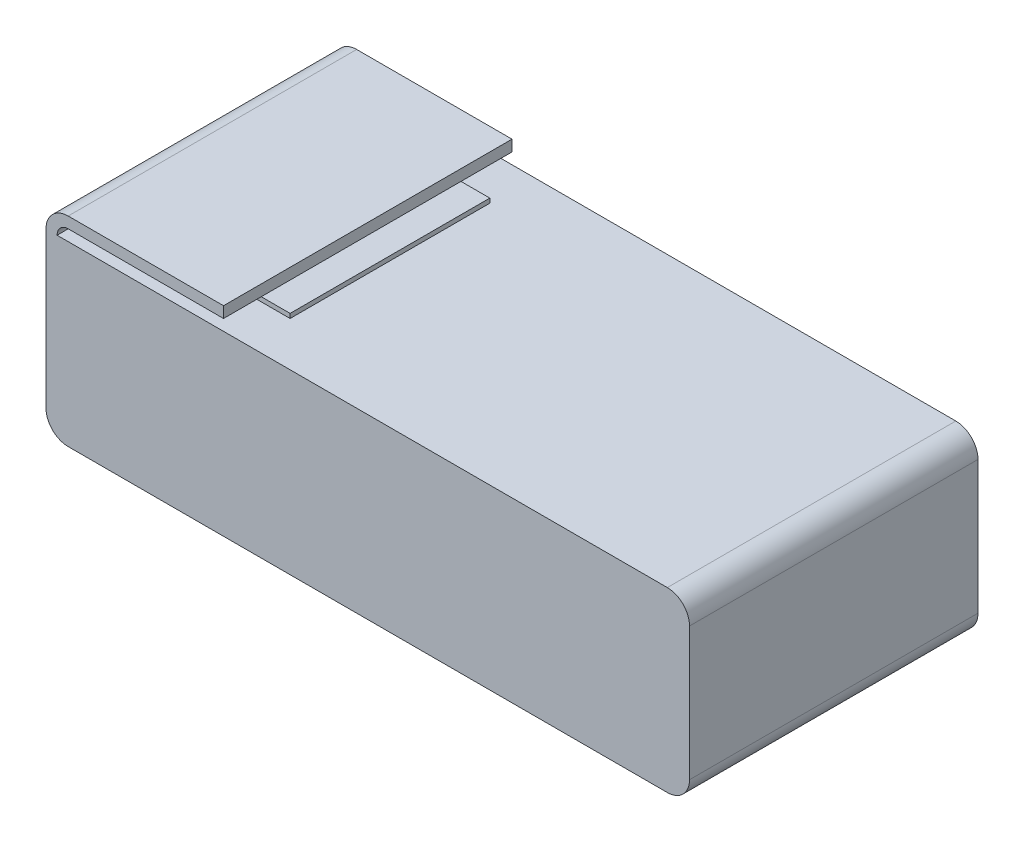
ISO-10303-21;
HEADER;
FILE_DESCRIPTION(('STEP AP214'),'2;1');
FILE_NAME('part.step','',(''),(''),'','','');
FILE_SCHEMA(('AUTOMOTIVE_DESIGN { 1 0 10303 214 1 1 1 1 }'));
ENDSEC;
DATA;
#1=APPLICATION_CONTEXT('core data for automotive mechanical design processes');
#2=APPLICATION_PROTOCOL_DEFINITION('international standard','automotive_design',2000,#1);
#3=PRODUCT_CONTEXT('',#1,'mechanical');
#4=PRODUCT('Part','Part','',(#3));
#5=PRODUCT_RELATED_PRODUCT_CATEGORY('part','',(#4));
#6=PRODUCT_DEFINITION_FORMATION('','',#4);
#7=PRODUCT_DEFINITION_CONTEXT('part definition',#1,'design');
#8=PRODUCT_DEFINITION('design','',#6,#7);
#9=PRODUCT_DEFINITION_SHAPE('','',#8);
#10=(LENGTH_UNIT() NAMED_UNIT(*) SI_UNIT(.MILLI.,.METRE.));
#11=(NAMED_UNIT(*) PLANE_ANGLE_UNIT() SI_UNIT($,.RADIAN.));
#12=(NAMED_UNIT(*) SI_UNIT($,.STERADIAN.) SOLID_ANGLE_UNIT());
#13=UNCERTAINTY_MEASURE_WITH_UNIT(LENGTH_MEASURE(1.E-05),#10,'distance_accuracy_value','');
#14=(GEOMETRIC_REPRESENTATION_CONTEXT(3) GLOBAL_UNCERTAINTY_ASSIGNED_CONTEXT((#13)) GLOBAL_UNIT_ASSIGNED_CONTEXT((#10,
#11,#12)) REPRESENTATION_CONTEXT('',''));
#15=CARTESIAN_POINT('',(0.,0.,0.));
#16=DIRECTION('',(0.,0.,1.));
#17=DIRECTION('',(1.,0.,0.));
#18=AXIS2_PLACEMENT_3D('',#15,#16,#17);
#19=CARTESIAN_POINT('',(5.00000000000004,0.,32.5));
#20=DIRECTION('',(0.,1.,0.));
#21=DIRECTION('',(0.,0.,1.));
#22=AXIS2_PLACEMENT_3D('',#19,#20,#21);
#23=PLANE('',#22);
#24=DIRECTION('',(0.,0.,-1.));
#25=VECTOR('',#24,1.);
#26=CARTESIAN_POINT('',(10.,0.,-27.5));
#27=LINE('',#26,#25);
#28=CARTESIAN_POINT('',(10.,0.,27.5));
#29=VERTEX_POINT('',#28);
#30=CARTESIAN_POINT('',(10.,0.,-27.5));
#31=VERTEX_POINT('',#30);
#32=EDGE_CURVE('E270',#29,#31,#27,.T.);
#33=ORIENTED_EDGE('',*,*,#32,.F.);
#34=DIRECTION('',(-1.,0.,0.));
#35=VECTOR('',#34,1.);
#36=CARTESIAN_POINT('',(10.,0.,27.5));
#37=LINE('',#36,#35);
#38=CARTESIAN_POINT('',(35.,0.,27.5));
#39=VERTEX_POINT('',#38);
#40=EDGE_CURVE('E283',#39,#29,#37,.T.);
#41=ORIENTED_EDGE('',*,*,#40,.F.);
#42=DIRECTION('',(0.,0.,1.));
#43=VECTOR('',#42,1.);
#44=CARTESIAN_POINT('',(35.,0.,-27.5));
#45=LINE('',#44,#43);
#46=CARTESIAN_POINT('',(35.,0.,-27.5));
#47=VERTEX_POINT('',#46);
#48=EDGE_CURVE('E292',#47,#39,#45,.T.);
#49=ORIENTED_EDGE('',*,*,#48,.F.);
#50=DIRECTION('',(1.,0.,0.));
#51=VECTOR('',#50,1.);
#52=CARTESIAN_POINT('',(10.,0.,-27.5));
#53=LINE('',#52,#51);
#54=EDGE_CURVE('E273',#31,#47,#53,.T.);
#55=ORIENTED_EDGE('',*,*,#54,.F.);
#56=EDGE_LOOP('',(#33,#41,#49,#55));
#57=FACE_BOUND('',#56,.T.);
#58=DIRECTION('',(1.,0.,0.));
#59=VECTOR('',#58,1.);
#60=CARTESIAN_POINT('',(5.00000000000004,0.,-32.5));
#61=LINE('',#60,#59);
#62=CARTESIAN_POINT('',(5.00000000000004,0.,-32.5));
#63=VERTEX_POINT('',#62);
#64=CARTESIAN_POINT('',(140.,0.,-32.5));
#65=VERTEX_POINT('',#64);
#66=EDGE_CURVE('E446',#63,#65,#61,.T.);
#67=ORIENTED_EDGE('',*,*,#66,.T.);
#68=DIRECTION('',(0.,0.,-1.));
#69=VECTOR('',#68,1.);
#70=CARTESIAN_POINT('',(140.,0.,32.5));
#71=LINE('',#70,#69);
#72=CARTESIAN_POINT('',(140.,0.,32.5));
#73=VERTEX_POINT('',#72);
#74=EDGE_CURVE('E457',#73,#65,#71,.T.);
#75=ORIENTED_EDGE('',*,*,#74,.F.);
#76=DIRECTION('',(1.,0.,0.));
#77=VECTOR('',#76,1.);
#78=CARTESIAN_POINT('',(5.00000000000004,0.,32.5));
#79=LINE('',#78,#77);
#80=CARTESIAN_POINT('',(5.00000000000004,0.,32.5));
#81=VERTEX_POINT('',#80);
#82=EDGE_CURVE('E414',#81,#73,#79,.T.);
#83=ORIENTED_EDGE('',*,*,#82,.F.);
#84=DIRECTION('',(0.,0.,-1.));
#85=VECTOR('',#84,1.);
#86=CARTESIAN_POINT('',(5.00000000000004,0.,32.5));
#87=LINE('',#86,#85);
#88=EDGE_CURVE('E455',#81,#63,#87,.T.);
#89=ORIENTED_EDGE('',*,*,#88,.T.);
#90=EDGE_LOOP('',(#67,#75,#83,#89));
#91=FACE_BOUND('',#90,.T.);
#92=DIRECTION('',(0.,0.,-1.));
#93=VECTOR('',#92,1.);
#94=CARTESIAN_POINT('',(110.,0.,-27.5));
#95=LINE('',#94,#93);
#96=CARTESIAN_POINT('',(110.,0.,27.5));
#97=VERTEX_POINT('',#96);
#98=CARTESIAN_POINT('',(110.,0.,-27.5));
#99=VERTEX_POINT('',#98);
#100=EDGE_CURVE('E269',#97,#99,#95,.T.);
#101=ORIENTED_EDGE('',*,*,#100,.F.);
#102=DIRECTION('',(-1.,0.,0.));
#103=VECTOR('',#102,1.);
#104=CARTESIAN_POINT('',(110.,0.,27.5));
#105=LINE('',#104,#103);
#106=CARTESIAN_POINT('',(135.,0.,27.5));
#107=VERTEX_POINT('',#106);
#108=EDGE_CURVE('E266',#107,#97,#105,.T.);
#109=ORIENTED_EDGE('',*,*,#108,.F.);
#110=DIRECTION('',(0.,0.,1.));
#111=VECTOR('',#110,1.);
#112=CARTESIAN_POINT('',(135.,0.,-27.5));
#113=LINE('',#112,#111);
#114=CARTESIAN_POINT('',(135.,0.,-27.5));
#115=VERTEX_POINT('',#114);
#116=EDGE_CURVE('E55',#115,#107,#113,.T.);
#117=ORIENTED_EDGE('',*,*,#116,.F.);
#118=DIRECTION('',(1.,0.,0.));
#119=VECTOR('',#118,1.);
#120=CARTESIAN_POINT('',(110.,0.,-27.5));
#121=LINE('',#120,#119);
#122=EDGE_CURVE('E50',#99,#115,#121,.T.);
#123=ORIENTED_EDGE('',*,*,#122,.F.);
#124=EDGE_LOOP('',(#101,#109,#117,#123));
#125=FACE_BOUND('',#124,.T.);
#126=ADVANCED_FACE('F33',(#57,#91,#125),#23,.F.);
#127=CARTESIAN_POINT('',(140.,40.,32.5));
#128=DIRECTION('',(0.,-1.,0.));
#129=DIRECTION('',(1.,0.,0.));
#130=AXIS2_PLACEMENT_3D('',#127,#128,#129);
#131=PLANE('',#130);
#132=DIRECTION('',(-1.,0.,0.));
#133=VECTOR('',#132,1.);
#134=CARTESIAN_POINT('',(140.,40.,-32.5));
#135=LINE('',#134,#133);
#136=CARTESIAN_POINT('',(140.,40.,-32.5));
#137=VERTEX_POINT('',#136);
#138=CARTESIAN_POINT('',(2.5,40.,-32.5));
#139=VERTEX_POINT('',#138);
#140=EDGE_CURVE('E435',#137,#139,#135,.T.);
#141=ORIENTED_EDGE('',*,*,#140,.T.);
#142=DIRECTION('',(0.,0.,-1.));
#143=VECTOR('',#142,1.);
#144=CARTESIAN_POINT('',(2.5,40.,32.5));
#145=LINE('',#144,#143);
#146=CARTESIAN_POINT('',(2.5,40.,-30.));
#147=VERTEX_POINT('',#146);
#148=EDGE_CURVE('E344',#139,#147,#145,.F.);
#149=ORIENTED_EDGE('',*,*,#148,.T.);
#150=DIRECTION('',(-1.,0.,0.));
#151=VECTOR('',#150,1.);
#152=CARTESIAN_POINT('',(140.,40.,-30.));
#153=LINE('',#152,#151);
#154=CARTESIAN_POINT('',(9.99999999999998,40.,-30.));
#155=VERTEX_POINT('',#154);
#156=EDGE_CURVE('E341',#155,#147,#153,.T.);
#157=ORIENTED_EDGE('',*,*,#156,.F.);
#158=DIRECTION('',(0.,0.,-1.));
#159=VECTOR('',#158,1.);
#160=CARTESIAN_POINT('',(9.99999999999998,40.,32.5));
#161=LINE('',#160,#159);
#162=CARTESIAN_POINT('',(9.99999999999998,40.,30.));
#163=VERTEX_POINT('',#162);
#164=EDGE_CURVE('E465',#163,#155,#161,.T.);
#165=ORIENTED_EDGE('',*,*,#164,.F.);
#166=DIRECTION('',(-1.,0.,0.));
#167=VECTOR('',#166,1.);
#168=CARTESIAN_POINT('',(140.,40.,30.));
#169=LINE('',#168,#167);
#170=CARTESIAN_POINT('',(2.5,40.,30.));
#171=VERTEX_POINT('',#170);
#172=EDGE_CURVE('E367',#163,#171,#169,.T.);
#173=ORIENTED_EDGE('',*,*,#172,.T.);
#174=DIRECTION('',(0.,0.,-1.));
#175=VECTOR('',#174,1.);
#176=CARTESIAN_POINT('',(2.5,40.,32.5));
#177=LINE('',#176,#175);
#178=CARTESIAN_POINT('',(2.5,40.,32.5));
#179=VERTEX_POINT('',#178);
#180=EDGE_CURVE('E489',#179,#171,#177,.T.);
#181=ORIENTED_EDGE('',*,*,#180,.F.);
#182=DIRECTION('',(-1.,0.,0.));
#183=VECTOR('',#182,1.);
#184=CARTESIAN_POINT('',(140.,40.,32.5));
#185=LINE('',#184,#183);
#186=CARTESIAN_POINT('',(140.,40.,32.5));
#187=VERTEX_POINT('',#186);
#188=EDGE_CURVE('E406',#187,#179,#185,.T.);
#189=ORIENTED_EDGE('',*,*,#188,.F.);
#190=DIRECTION('',(0.,0.,-1.));
#191=VECTOR('',#190,1.);
#192=CARTESIAN_POINT('',(140.,40.,32.5));
#193=LINE('',#192,#191);
#194=EDGE_CURVE('E463',#187,#137,#193,.T.);
#195=ORIENTED_EDGE('',*,*,#194,.T.);
#196=EDGE_LOOP('',(#141,#149,#157,#165,#173,#181,#189,#195));
#197=FACE_BOUND('',#196,.T.);
#198=DIRECTION('',(0.,0.,1.));
#199=VECTOR('',#198,1.);
#200=CARTESIAN_POINT('',(30.,40.,22.5));
#201=LINE('',#200,#199);
#202=CARTESIAN_POINT('',(30.,40.,-22.5));
#203=VERTEX_POINT('',#202);
#204=CARTESIAN_POINT('',(30.,40.,22.5));
#205=VERTEX_POINT('',#204);
#206=EDGE_CURVE('E308',#203,#205,#201,.T.);
#207=ORIENTED_EDGE('',*,*,#206,.F.);
#208=DIRECTION('',(-1.,0.,0.));
#209=VECTOR('',#208,1.);
#210=CARTESIAN_POINT('',(30.,40.,-22.5));
#211=LINE('',#210,#209);
#212=CARTESIAN_POINT('',(45.,40.,-22.5));
#213=VERTEX_POINT('',#212);
#214=EDGE_CURVE('E313',#213,#203,#211,.T.);
#215=ORIENTED_EDGE('',*,*,#214,.F.);
#216=DIRECTION('',(0.,0.,-1.));
#217=VECTOR('',#216,1.);
#218=CARTESIAN_POINT('',(45.,40.,22.5));
#219=LINE('',#218,#217);
#220=CARTESIAN_POINT('',(45.,40.,22.5));
#221=VERTEX_POINT('',#220);
#222=EDGE_CURVE('E325',#221,#213,#219,.T.);
#223=ORIENTED_EDGE('',*,*,#222,.F.);
#224=DIRECTION('',(1.,0.,0.));
#225=VECTOR('',#224,1.);
#226=CARTESIAN_POINT('',(30.,40.,22.5));
#227=LINE('',#226,#225);
#228=EDGE_CURVE('E322',#205,#221,#227,.T.);
#229=ORIENTED_EDGE('',*,*,#228,.F.);
#230=EDGE_LOOP('',(#207,#215,#223,#229));
#231=FACE_BOUND('',#230,.T.);
#232=ADVANCED_FACE('F536',(#197,#231),#131,.F.);
#233=CARTESIAN_POINT('',(9.99999999999998,40.,32.5));
#234=DIRECTION('',(1.,0.,0.));
#235=DIRECTION('',(0.,0.,-1.));
#236=AXIS2_PLACEMENT_3D('',#233,#234,#235);
#237=PLANE('',#236);
#238=DIRECTION('',(0.,1.,0.));
#239=VECTOR('',#238,1.);
#240=CARTESIAN_POINT('',(9.99999999999998,40.,-30.));
#241=LINE('',#240,#239);
#242=CARTESIAN_POINT('',(9.99999999999998,37.5,-30.));
#243=VERTEX_POINT('',#242);
#244=EDGE_CURVE('E365',#243,#155,#241,.T.);
#245=ORIENTED_EDGE('',*,*,#244,.F.);
#246=DIRECTION('',(0.,0.,-1.));
#247=VECTOR('',#246,1.);
#248=CARTESIAN_POINT('',(9.99999999999998,37.5,32.5));
#249=LINE('',#248,#247);
#250=CARTESIAN_POINT('',(9.99999999999998,37.5,30.));
#251=VERTEX_POINT('',#250);
#252=EDGE_CURVE('E468',#251,#243,#249,.T.);
#253=ORIENTED_EDGE('',*,*,#252,.F.);
#254=DIRECTION('',(0.,-1.,0.));
#255=VECTOR('',#254,1.);
#256=CARTESIAN_POINT('',(9.99999999999998,40.,30.));
#257=LINE('',#256,#255);
#258=EDGE_CURVE('E389',#163,#251,#257,.T.);
#259=ORIENTED_EDGE('',*,*,#258,.F.);
#260=ORIENTED_EDGE('',*,*,#164,.T.);
#261=EDGE_LOOP('',(#245,#253,#259,#260));
#262=FACE_BOUND('',#261,.T.);
#263=ADVANCED_FACE('F569',(#262),#237,.F.);
#264=CARTESIAN_POINT('',(140.,37.5,32.5));
#265=DIRECTION('',(0.,-1.,0.));
#266=DIRECTION('',(1.,0.,0.));
#267=AXIS2_PLACEMENT_3D('',#264,#265,#266);
#268=PLANE('',#267);
#269=ORIENTED_EDGE('',*,*,#252,.T.);
#270=DIRECTION('',(1.,0.,0.));
#271=VECTOR('',#270,1.);
#272=CARTESIAN_POINT('',(140.,37.5,-30.));
#273=LINE('',#272,#271);
#274=CARTESIAN_POINT('',(140.,37.5,-30.));
#275=VERTEX_POINT('',#274);
#276=EDGE_CURVE('E362',#243,#275,#273,.T.);
#277=ORIENTED_EDGE('',*,*,#276,.T.);
#278=DIRECTION('',(0.,0.,-1.));
#279=VECTOR('',#278,1.);
#280=CARTESIAN_POINT('',(140.,37.5,32.5));
#281=LINE('',#280,#279);
#282=CARTESIAN_POINT('',(140.,37.5,30.));
#283=VERTEX_POINT('',#282);
#284=EDGE_CURVE('E471',#283,#275,#281,.T.);
#285=ORIENTED_EDGE('',*,*,#284,.F.);
#286=DIRECTION('',(-1.,0.,0.));
#287=VECTOR('',#286,1.);
#288=CARTESIAN_POINT('',(140.,37.5,30.));
#289=LINE('',#288,#287);
#290=EDGE_CURVE('E386',#283,#251,#289,.T.);
#291=ORIENTED_EDGE('',*,*,#290,.T.);
#292=EDGE_LOOP('',(#269,#277,#285,#291));
#293=FACE_BOUND('',#292,.T.);
#294=ADVANCED_FACE('F565',(#293),#268,.T.);
#295=CARTESIAN_POINT('',(140.,35.,32.5));
#296=DIRECTION('',(0.,0.,-1.));
#297=DIRECTION('',(-1.,0.,0.));
#298=AXIS2_PLACEMENT_3D('',#295,#296,#297);
#299=CYLINDRICAL_SURFACE('',#298,2.5);
#300=ORIENTED_EDGE('',*,*,#284,.T.);
#301=CARTESIAN_POINT('',(140.,35.,-30.));
#302=DIRECTION('',(0.,0.,-1.));
#303=DIRECTION('',(-1.,0.,0.));
#304=AXIS2_PLACEMENT_3D('',#301,#302,#303);
#305=CIRCLE('',#304,2.5);
#306=CARTESIAN_POINT('',(142.5,35.,-30.));
#307=VERTEX_POINT('',#306);
#308=EDGE_CURVE('E359',#275,#307,#305,.T.);
#309=ORIENTED_EDGE('',*,*,#308,.T.);
#310=DIRECTION('',(0.,0.,-1.));
#311=VECTOR('',#310,1.);
#312=CARTESIAN_POINT('',(142.5,35.,32.5));
#313=LINE('',#312,#311);
#314=CARTESIAN_POINT('',(142.5,35.,30.));
#315=VERTEX_POINT('',#314);
#316=EDGE_CURVE('E474',#315,#307,#313,.T.);
#317=ORIENTED_EDGE('',*,*,#316,.F.);
#318=CARTESIAN_POINT('',(140.,35.,30.));
#319=DIRECTION('',(0.,0.,1.));
#320=DIRECTION('',(1.,0.,0.));
#321=AXIS2_PLACEMENT_3D('',#318,#319,#320);
#322=CIRCLE('',#321,2.5);
#323=EDGE_CURVE('E383',#315,#283,#322,.T.);
#324=ORIENTED_EDGE('',*,*,#323,.T.);
#325=EDGE_LOOP('',(#300,#309,#317,#324));
#326=FACE_BOUND('',#325,.T.);
#327=ADVANCED_FACE('F562',(#326),#299,.F.);
#328=CARTESIAN_POINT('',(142.5,5.00000000000002,32.5));
#329=DIRECTION('',(-1.,0.,0.));
#330=DIRECTION('',(0.,0.,1.));
#331=AXIS2_PLACEMENT_3D('',#328,#329,#330);
#332=PLANE('',#331);
#333=ORIENTED_EDGE('',*,*,#316,.T.);
#334=DIRECTION('',(0.,-1.,0.));
#335=VECTOR('',#334,1.);
#336=CARTESIAN_POINT('',(142.5,5.00000000000002,-30.));
#337=LINE('',#336,#335);
#338=CARTESIAN_POINT('',(142.5,5.00000000000002,-30.));
#339=VERTEX_POINT('',#338);
#340=EDGE_CURVE('E356',#307,#339,#337,.T.);
#341=ORIENTED_EDGE('',*,*,#340,.T.);
#342=DIRECTION('',(0.,0.,-1.));
#343=VECTOR('',#342,1.);
#344=CARTESIAN_POINT('',(142.5,5.00000000000002,32.5));
#345=LINE('',#344,#343);
#346=CARTESIAN_POINT('',(142.5,5.,30.));
#347=VERTEX_POINT('',#346);
#348=EDGE_CURVE('E477',#347,#339,#345,.T.);
#349=ORIENTED_EDGE('',*,*,#348,.F.);
#350=DIRECTION('',(0.,1.,0.));
#351=VECTOR('',#350,1.);
#352=CARTESIAN_POINT('',(142.5,5.00000000000002,30.));
#353=LINE('',#352,#351);
#354=EDGE_CURVE('E380',#347,#315,#353,.T.);
#355=ORIENTED_EDGE('',*,*,#354,.T.);
#356=EDGE_LOOP('',(#333,#341,#349,#355));
#357=FACE_BOUND('',#356,.T.);
#358=ADVANCED_FACE('F559',(#357),#332,.T.);
#359=CARTESIAN_POINT('',(140.,5.,32.5));
#360=DIRECTION('',(0.,0.,-1.));
#361=DIRECTION('',(-1.,0.,0.));
#362=AXIS2_PLACEMENT_3D('',#359,#360,#361);
#363=CYLINDRICAL_SURFACE('',#362,2.5);
#364=ORIENTED_EDGE('',*,*,#348,.T.);
#365=CARTESIAN_POINT('',(140.,5.,-30.));
#366=DIRECTION('',(0.,0.,-1.));
#367=DIRECTION('',(-1.,0.,0.));
#368=AXIS2_PLACEMENT_3D('',#365,#366,#367);
#369=CIRCLE('',#368,2.5);
#370=CARTESIAN_POINT('',(140.,2.5,-30.));
#371=VERTEX_POINT('',#370);
#372=EDGE_CURVE('E353',#339,#371,#369,.T.);
#373=ORIENTED_EDGE('',*,*,#372,.T.);
#374=DIRECTION('',(0.,0.,-1.));
#375=VECTOR('',#374,1.);
#376=CARTESIAN_POINT('',(140.,2.5,32.5));
#377=LINE('',#376,#375);
#378=CARTESIAN_POINT('',(140.,2.5,30.));
#379=VERTEX_POINT('',#378);
#380=EDGE_CURVE('E480',#379,#371,#377,.T.);
#381=ORIENTED_EDGE('',*,*,#380,.F.);
#382=CARTESIAN_POINT('',(140.,5.,30.));
#383=DIRECTION('',(0.,0.,1.));
#384=DIRECTION('',(1.,0.,0.));
#385=AXIS2_PLACEMENT_3D('',#382,#383,#384);
#386=CIRCLE('',#385,2.5);
#387=EDGE_CURVE('E377',#379,#347,#386,.T.);
#388=ORIENTED_EDGE('',*,*,#387,.T.);
#389=EDGE_LOOP('',(#364,#373,#381,#388));
#390=FACE_BOUND('',#389,.T.);
#391=ADVANCED_FACE('F556',(#390),#363,.F.);
#392=CARTESIAN_POINT('',(5.00000000000002,2.5,32.5));
#393=DIRECTION('',(0.,1.,0.));
#394=DIRECTION('',(0.,0.,1.));
#395=AXIS2_PLACEMENT_3D('',#392,#393,#394);
#396=PLANE('',#395);
#397=ORIENTED_EDGE('',*,*,#380,.T.);
#398=DIRECTION('',(-1.,0.,0.));
#399=VECTOR('',#398,1.);
#400=CARTESIAN_POINT('',(5.00000000000002,2.5,-30.));
#401=LINE('',#400,#399);
#402=CARTESIAN_POINT('',(5.00000000000002,2.5,-30.));
#403=VERTEX_POINT('',#402);
#404=EDGE_CURVE('E350',#371,#403,#401,.T.);
#405=ORIENTED_EDGE('',*,*,#404,.T.);
#406=DIRECTION('',(0.,0.,-1.));
#407=VECTOR('',#406,1.);
#408=CARTESIAN_POINT('',(5.00000000000002,2.5,32.5));
#409=LINE('',#408,#407);
#410=CARTESIAN_POINT('',(5.00000000000002,2.5,30.));
#411=VERTEX_POINT('',#410);
#412=EDGE_CURVE('E483',#411,#403,#409,.T.);
#413=ORIENTED_EDGE('',*,*,#412,.F.);
#414=DIRECTION('',(1.,0.,0.));
#415=VECTOR('',#414,1.);
#416=CARTESIAN_POINT('',(5.00000000000002,2.5,30.));
#417=LINE('',#416,#415);
#418=EDGE_CURVE('E374',#411,#379,#417,.T.);
#419=ORIENTED_EDGE('',*,*,#418,.T.);
#420=EDGE_LOOP('',(#397,#405,#413,#419));
#421=FACE_BOUND('',#420,.T.);
#422=ADVANCED_FACE('F553',(#421),#396,.T.);
#423=CARTESIAN_POINT('',(5.,5.,32.5));
#424=DIRECTION('',(0.,0.,-1.));
#425=DIRECTION('',(-1.,0.,0.));
#426=AXIS2_PLACEMENT_3D('',#423,#424,#425);
#427=CYLINDRICAL_SURFACE('',#426,2.5);
#428=CARTESIAN_POINT('',(5.,5.,-30.));
#429=DIRECTION('',(0.,0.,-1.));
#430=DIRECTION('',(-1.,0.,0.));
#431=AXIS2_PLACEMENT_3D('',#428,#429,#430);
#432=CIRCLE('',#431,2.5);
#433=CARTESIAN_POINT('',(2.5,5.00000000000004,-30.));
#434=VERTEX_POINT('',#433);
#435=EDGE_CURVE('E348',#434,#403,#432,.F.);
#436=ORIENTED_EDGE('',*,*,#435,.F.);
#437=DIRECTION('',(0.,0.,-1.));
#438=VECTOR('',#437,1.);
#439=CARTESIAN_POINT('',(2.5,5.00000000000004,32.5));
#440=LINE('',#439,#438);
#441=CARTESIAN_POINT('',(2.5,5.00000000000004,30.));
#442=VERTEX_POINT('',#441);
#443=EDGE_CURVE('E486',#442,#434,#440,.T.);
#444=ORIENTED_EDGE('',*,*,#443,.F.);
#445=CARTESIAN_POINT('',(5.,5.,30.));
#446=DIRECTION('',(0.,0.,1.));
#447=DIRECTION('',(1.,0.,0.));
#448=AXIS2_PLACEMENT_3D('',#445,#446,#447);
#449=CIRCLE('',#448,2.5);
#450=EDGE_CURVE('E372',#411,#442,#449,.F.);
#451=ORIENTED_EDGE('',*,*,#450,.F.);
#452=ORIENTED_EDGE('',*,*,#412,.T.);
#453=EDGE_LOOP('',(#436,#444,#451,#452));
#454=FACE_BOUND('',#453,.T.);
#455=ADVANCED_FACE('F550',(#454),#427,.F.);
#456=CARTESIAN_POINT('',(2.5,5.00000000000004,32.5));
#457=DIRECTION('',(-1.,0.,0.));
#458=DIRECTION('',(0.,0.,1.));
#459=AXIS2_PLACEMENT_3D('',#456,#457,#458);
#460=PLANE('',#459);
#461=DIRECTION('',(0.,-1.,0.));
#462=VECTOR('',#461,1.);
#463=CARTESIAN_POINT('',(2.5,5.00000000000004,-30.));
#464=LINE('',#463,#462);
#465=EDGE_CURVE('E346',#147,#434,#464,.T.);
#466=ORIENTED_EDGE('',*,*,#465,.F.);
#467=EDGE_CURVE('E492',#171,#147,#177,.T.);
#468=ORIENTED_EDGE('',*,*,#467,.F.);
#469=DIRECTION('',(0.,1.,0.));
#470=VECTOR('',#469,1.);
#471=CARTESIAN_POINT('',(2.5,5.00000000000004,30.));
#472=LINE('',#471,#470);
#473=EDGE_CURVE('E369',#442,#171,#472,.T.);
#474=ORIENTED_EDGE('',*,*,#473,.F.);
#475=ORIENTED_EDGE('',*,*,#443,.T.);
#476=EDGE_LOOP('',(#466,#468,#474,#475));
#477=FACE_BOUND('',#476,.T.);
#478=ADVANCED_FACE('F545',(#477),#460,.F.);
#479=CARTESIAN_POINT('',(5.,40.,32.5));
#480=DIRECTION('',(0.,0.,-1.));
#481=DIRECTION('',(-1.,0.,0.));
#482=AXIS2_PLACEMENT_3D('',#479,#480,#481);
#483=CYLINDRICAL_SURFACE('',#482,5.);
#484=CARTESIAN_POINT('',(5.,40.,-32.5));
#485=DIRECTION('',(0.,0.,-1.));
#486=DIRECTION('',(-1.,0.,0.));
#487=AXIS2_PLACEMENT_3D('',#484,#485,#486);
#488=CIRCLE('',#487,5.);
#489=CARTESIAN_POINT('',(0.,40.,-32.5));
#490=VERTEX_POINT('',#489);
#491=CARTESIAN_POINT('',(5.,45.,-32.5));
#492=VERTEX_POINT('',#491);
#493=EDGE_CURVE('E391',#490,#492,#488,.T.);
#494=ORIENTED_EDGE('',*,*,#493,.F.);
#495=DIRECTION('',(0.,0.,-1.));
#496=VECTOR('',#495,1.);
#497=CARTESIAN_POINT('',(0.,40.,32.5));
#498=LINE('',#497,#496);
#499=CARTESIAN_POINT('',(0.,40.,32.5));
#500=VERTEX_POINT('',#499);
#501=EDGE_CURVE('E11',#500,#490,#498,.T.);
#502=ORIENTED_EDGE('',*,*,#501,.F.);
#503=CARTESIAN_POINT('',(5.,40.,32.5));
#504=DIRECTION('',(0.,0.,-1.));
#505=DIRECTION('',(-1.,0.,0.));
#506=AXIS2_PLACEMENT_3D('',#503,#504,#505);
#507=CIRCLE('',#506,5.);
#508=CARTESIAN_POINT('',(5.,45.,32.5));
#509=VERTEX_POINT('',#508);
#510=EDGE_CURVE('E392',#500,#509,#507,.T.);
#511=ORIENTED_EDGE('',*,*,#510,.T.);
#512=DIRECTION('',(0.,0.,-1.));
#513=VECTOR('',#512,1.);
#514=CARTESIAN_POINT('',(5.,45.,32.5));
#515=LINE('',#514,#513);
#516=EDGE_CURVE('E37',#509,#492,#515,.T.);
#517=ORIENTED_EDGE('',*,*,#516,.T.);
#518=EDGE_LOOP('',(#494,#502,#511,#517));
#519=FACE_BOUND('',#518,.T.);
#520=ADVANCED_FACE('F35',(#519),#483,.T.);
#521=CARTESIAN_POINT('',(0.,5.00000000000004,32.5));
#522=DIRECTION('',(-1.,0.,0.));
#523=DIRECTION('',(0.,0.,1.));
#524=AXIS2_PLACEMENT_3D('',#521,#522,#523);
#525=PLANE('',#524);
#526=DIRECTION('',(0.,1.,0.));
#527=VECTOR('',#526,1.);
#528=CARTESIAN_POINT('',(0.,5.00000000000004,-32.5));
#529=LINE('',#528,#527);
#530=CARTESIAN_POINT('',(0.,5.00000000000004,-32.5));
#531=VERTEX_POINT('',#530);
#532=EDGE_CURVE('E396',#531,#490,#529,.T.);
#533=ORIENTED_EDGE('',*,*,#532,.F.);
#534=DIRECTION('',(0.,0.,-1.));
#535=VECTOR('',#534,1.);
#536=CARTESIAN_POINT('',(0.,5.00000000000004,32.5));
#537=LINE('',#536,#535);
#538=CARTESIAN_POINT('',(0.,5.00000000000004,32.5));
#539=VERTEX_POINT('',#538);
#540=EDGE_CURVE('E42',#539,#531,#537,.T.);
#541=ORIENTED_EDGE('',*,*,#540,.F.);
#542=DIRECTION('',(0.,1.,0.));
#543=VECTOR('',#542,1.);
#544=CARTESIAN_POINT('',(0.,5.00000000000004,32.5));
#545=LINE('',#544,#543);
#546=EDGE_CURVE('E419',#539,#500,#545,.T.);
#547=ORIENTED_EDGE('',*,*,#546,.T.);
#548=ORIENTED_EDGE('',*,*,#501,.T.);
#549=EDGE_LOOP('',(#533,#541,#547,#548));
#550=FACE_BOUND('',#549,.T.);
#551=ADVANCED_FACE('F513',(#550),#525,.T.);
#552=CARTESIAN_POINT('',(5.,5.,32.5));
#553=DIRECTION('',(0.,0.,-1.));
#554=DIRECTION('',(-1.,0.,0.));
#555=AXIS2_PLACEMENT_3D('',#552,#553,#554);
#556=CYLINDRICAL_SURFACE('',#555,5.);
#557=CARTESIAN_POINT('',(5.,5.,-32.5));
#558=DIRECTION('',(0.,0.,-1.));
#559=DIRECTION('',(-1.,0.,0.));
#560=AXIS2_PLACEMENT_3D('',#557,#558,#559);
#561=CIRCLE('',#560,5.);
#562=EDGE_CURVE('E449',#63,#531,#561,.T.);
#563=ORIENTED_EDGE('',*,*,#562,.F.);
#564=ORIENTED_EDGE('',*,*,#88,.F.);
#565=CARTESIAN_POINT('',(5.,5.,32.5));
#566=DIRECTION('',(0.,0.,-1.));
#567=DIRECTION('',(-1.,0.,0.));
#568=AXIS2_PLACEMENT_3D('',#565,#566,#567);
#569=CIRCLE('',#568,5.);
#570=EDGE_CURVE('E416',#81,#539,#569,.T.);
#571=ORIENTED_EDGE('',*,*,#570,.T.);
#572=ORIENTED_EDGE('',*,*,#540,.T.);
#573=EDGE_LOOP('',(#563,#564,#571,#572));
#574=FACE_BOUND('',#573,.T.);
#575=ADVANCED_FACE('F594',(#574),#556,.T.);
#576=CARTESIAN_POINT('',(140.,5.,32.5));
#577=DIRECTION('',(0.,0.,-1.));
#578=DIRECTION('',(-1.,0.,0.));
#579=AXIS2_PLACEMENT_3D('',#576,#577,#578);
#580=CYLINDRICAL_SURFACE('',#579,5.);
#581=CARTESIAN_POINT('',(140.,5.,-32.5));
#582=DIRECTION('',(0.,0.,1.));
#583=DIRECTION('',(1.,0.,0.));
#584=AXIS2_PLACEMENT_3D('',#581,#582,#583);
#585=CIRCLE('',#584,5.);
#586=CARTESIAN_POINT('',(145.,5.00000000000004,-32.5));
#587=VERTEX_POINT('',#586);
#588=EDGE_CURVE('E443',#65,#587,#585,.T.);
#589=ORIENTED_EDGE('',*,*,#588,.T.);
#590=DIRECTION('',(0.,0.,-1.));
#591=VECTOR('',#590,1.);
#592=CARTESIAN_POINT('',(145.,5.00000000000004,32.5));
#593=LINE('',#592,#591);
#594=CARTESIAN_POINT('',(145.,5.00000000000004,32.5));
#595=VERTEX_POINT('',#594);
#596=EDGE_CURVE('E459',#595,#587,#593,.T.);
#597=ORIENTED_EDGE('',*,*,#596,.F.);
#598=CARTESIAN_POINT('',(140.,5.,32.5));
#599=DIRECTION('',(0.,0.,1.));
#600=DIRECTION('',(1.,0.,0.));
#601=AXIS2_PLACEMENT_3D('',#598,#599,#600);
#602=CIRCLE('',#601,5.);
#603=EDGE_CURVE('E412',#73,#595,#602,.T.);
#604=ORIENTED_EDGE('',*,*,#603,.F.);
#605=ORIENTED_EDGE('',*,*,#74,.T.);
#606=EDGE_LOOP('',(#589,#597,#604,#605));
#607=FACE_BOUND('',#606,.T.);
#608=ADVANCED_FACE('F596',(#607),#580,.T.);
#609=CARTESIAN_POINT('',(145.,5.00000000000004,32.5));
#610=DIRECTION('',(-1.,0.,0.));
#611=DIRECTION('',(0.,0.,1.));
#612=AXIS2_PLACEMENT_3D('',#609,#610,#611);
#613=PLANE('',#612);
#614=DIRECTION('',(0.,1.,0.));
#615=VECTOR('',#614,1.);
#616=CARTESIAN_POINT('',(145.,5.00000000000004,-32.5));
#617=LINE('',#616,#615);
#618=CARTESIAN_POINT('',(145.,35.,-32.5));
#619=VERTEX_POINT('',#618);
#620=EDGE_CURVE('E440',#587,#619,#617,.T.);
#621=ORIENTED_EDGE('',*,*,#620,.T.);
#622=DIRECTION('',(0.,0.,-1.));
#623=VECTOR('',#622,1.);
#624=CARTESIAN_POINT('',(145.,35.,32.5));
#625=LINE('',#624,#623);
#626=CARTESIAN_POINT('',(145.,35.,32.5));
#627=VERTEX_POINT('',#626);
#628=EDGE_CURVE('E461',#627,#619,#625,.T.);
#629=ORIENTED_EDGE('',*,*,#628,.F.);
#630=DIRECTION('',(0.,1.,0.));
#631=VECTOR('',#630,1.);
#632=CARTESIAN_POINT('',(145.,5.00000000000004,32.5));
#633=LINE('',#632,#631);
#634=EDGE_CURVE('E410',#595,#627,#633,.T.);
#635=ORIENTED_EDGE('',*,*,#634,.F.);
#636=ORIENTED_EDGE('',*,*,#596,.T.);
#637=EDGE_LOOP('',(#621,#629,#635,#636));
#638=FACE_BOUND('',#637,.T.);
#639=ADVANCED_FACE('F599',(#638),#613,.F.);
#640=CARTESIAN_POINT('',(140.,35.,32.5));
#641=DIRECTION('',(0.,0.,-1.));
#642=DIRECTION('',(-1.,0.,0.));
#643=AXIS2_PLACEMENT_3D('',#640,#641,#642);
#644=CYLINDRICAL_SURFACE('',#643,5.);
#645=CARTESIAN_POINT('',(140.,35.,-32.5));
#646=DIRECTION('',(0.,0.,1.));
#647=DIRECTION('',(1.,0.,0.));
#648=AXIS2_PLACEMENT_3D('',#645,#646,#647);
#649=CIRCLE('',#648,5.);
#650=EDGE_CURVE('E437',#619,#137,#649,.T.);
#651=ORIENTED_EDGE('',*,*,#650,.T.);
#652=ORIENTED_EDGE('',*,*,#194,.F.);
#653=CARTESIAN_POINT('',(140.,35.,32.5));
#654=DIRECTION('',(0.,0.,1.));
#655=DIRECTION('',(1.,0.,0.));
#656=AXIS2_PLACEMENT_3D('',#653,#654,#655);
#657=CIRCLE('',#656,5.);
#658=EDGE_CURVE('E408',#627,#187,#657,.T.);
#659=ORIENTED_EDGE('',*,*,#658,.F.);
#660=ORIENTED_EDGE('',*,*,#628,.T.);
#661=EDGE_LOOP('',(#651,#652,#659,#660));
#662=FACE_BOUND('',#661,.T.);
#663=ADVANCED_FACE('F603',(#662),#644,.T.);
#664=CARTESIAN_POINT('',(5.,40.,32.5));
#665=DIRECTION('',(0.,0.,-1.));
#666=DIRECTION('',(-1.,0.,0.));
#667=AXIS2_PLACEMENT_3D('',#664,#665,#666);
#668=CYLINDRICAL_SURFACE('',#667,2.5);
#669=CARTESIAN_POINT('',(5.,40.,-32.5));
#670=DIRECTION('',(0.,0.,-1.));
#671=DIRECTION('',(-1.,0.,0.));
#672=AXIS2_PLACEMENT_3D('',#669,#670,#671);
#673=CIRCLE('',#672,2.5);
#674=CARTESIAN_POINT('',(5.,42.5,-32.5));
#675=VERTEX_POINT('',#674);
#676=EDGE_CURVE('E433',#139,#675,#673,.T.);
#677=ORIENTED_EDGE('',*,*,#676,.T.);
#678=DIRECTION('',(0.,0.,-1.));
#679=VECTOR('',#678,1.);
#680=CARTESIAN_POINT('',(5.,42.5,32.5));
#681=LINE('',#680,#679);
#682=CARTESIAN_POINT('',(5.,42.5,32.5));
#683=VERTEX_POINT('',#682);
#684=EDGE_CURVE('E493',#683,#675,#681,.T.);
#685=ORIENTED_EDGE('',*,*,#684,.F.);
#686=CARTESIAN_POINT('',(5.,40.,32.5));
#687=DIRECTION('',(0.,0.,-1.));
#688=DIRECTION('',(-1.,0.,0.));
#689=AXIS2_PLACEMENT_3D('',#686,#687,#688);
#690=CIRCLE('',#689,2.5);
#691=EDGE_CURVE('E404',#179,#683,#690,.T.);
#692=ORIENTED_EDGE('',*,*,#691,.F.);
#693=ORIENTED_EDGE('',*,*,#180,.T.);
#694=ORIENTED_EDGE('',*,*,#467,.T.);
#695=ORIENTED_EDGE('',*,*,#148,.F.);
#696=EDGE_LOOP('',(#677,#685,#692,#693,#694,#695));
#697=FACE_BOUND('',#696,.T.);
#698=ADVANCED_FACE('F530',(#697),#668,.F.);
#699=CARTESIAN_POINT('',(5.,42.5,32.5));
#700=DIRECTION('',(0.,1.,0.));
#701=DIRECTION('',(0.,0.,1.));
#702=AXIS2_PLACEMENT_3D('',#699,#700,#701);
#703=PLANE('',#702);
#704=DIRECTION('',(1.,0.,0.));
#705=VECTOR('',#704,1.);
#706=CARTESIAN_POINT('',(5.,42.5,-32.5));
#707=LINE('',#706,#705);
#708=CARTESIAN_POINT('',(40.,42.5,-32.5));
#709=VERTEX_POINT('',#708);
#710=EDGE_CURVE('E430',#675,#709,#707,.T.);
#711=ORIENTED_EDGE('',*,*,#710,.T.);
#712=DIRECTION('',(0.,0.,-1.));
#713=VECTOR('',#712,1.);
#714=CARTESIAN_POINT('',(40.,42.5,32.5));
#715=LINE('',#714,#713);
#716=CARTESIAN_POINT('',(40.,42.5,32.5));
#717=VERTEX_POINT('',#716);
#718=EDGE_CURVE('E496',#717,#709,#715,.T.);
#719=ORIENTED_EDGE('',*,*,#718,.F.);
#720=DIRECTION('',(1.,0.,0.));
#721=VECTOR('',#720,1.);
#722=CARTESIAN_POINT('',(5.,42.5,32.5));
#723=LINE('',#722,#721);
#724=EDGE_CURVE('E402',#683,#717,#723,.T.);
#725=ORIENTED_EDGE('',*,*,#724,.F.);
#726=ORIENTED_EDGE('',*,*,#684,.T.);
#727=EDGE_LOOP('',(#711,#719,#725,#726));
#728=FACE_BOUND('',#727,.T.);
#729=ADVANCED_FACE('F526',(#728),#703,.F.);
#730=CARTESIAN_POINT('',(40.,45.,32.5));
#731=DIRECTION('',(1.,0.,0.));
#732=DIRECTION('',(0.,1.,0.));
#733=AXIS2_PLACEMENT_3D('',#730,#731,#732);
#734=PLANE('',#733);
#735=DIRECTION('',(0.,-1.,0.));
#736=VECTOR('',#735,1.);
#737=CARTESIAN_POINT('',(40.,45.,-32.5));
#738=LINE('',#737,#736);
#739=CARTESIAN_POINT('',(40.,45.,-32.5));
#740=VERTEX_POINT('',#739);
#741=EDGE_CURVE('E427',#740,#709,#738,.T.);
#742=ORIENTED_EDGE('',*,*,#741,.F.);
#743=DIRECTION('',(0.,0.,-1.));
#744=VECTOR('',#743,1.);
#745=CARTESIAN_POINT('',(40.,45.,32.5));
#746=LINE('',#745,#744);
#747=CARTESIAN_POINT('',(40.,45.,32.5));
#748=VERTEX_POINT('',#747);
#749=EDGE_CURVE('E497',#748,#740,#746,.T.);
#750=ORIENTED_EDGE('',*,*,#749,.F.);
#751=DIRECTION('',(0.,-1.,0.));
#752=VECTOR('',#751,1.);
#753=CARTESIAN_POINT('',(40.,45.,32.5));
#754=LINE('',#753,#752);
#755=EDGE_CURVE('E399',#748,#717,#754,.T.);
#756=ORIENTED_EDGE('',*,*,#755,.T.);
#757=ORIENTED_EDGE('',*,*,#718,.T.);
#758=EDGE_LOOP('',(#742,#750,#756,#757));
#759=FACE_BOUND('',#758,.T.);
#760=ADVANCED_FACE('F522',(#759),#734,.T.);
#761=CARTESIAN_POINT('',(5.,45.,32.5));
#762=DIRECTION('',(0.,1.,0.));
#763=DIRECTION('',(0.,0.,1.));
#764=AXIS2_PLACEMENT_3D('',#761,#762,#763);
#765=PLANE('',#764);
#766=DIRECTION('',(1.,0.,0.));
#767=VECTOR('',#766,1.);
#768=CARTESIAN_POINT('',(5.,45.,-32.5));
#769=LINE('',#768,#767);
#770=EDGE_CURVE('E424',#492,#740,#769,.T.);
#771=ORIENTED_EDGE('',*,*,#770,.F.);
#772=ORIENTED_EDGE('',*,*,#516,.F.);
#773=DIRECTION('',(1.,0.,0.));
#774=VECTOR('',#773,1.);
#775=CARTESIAN_POINT('',(5.,45.,32.5));
#776=LINE('',#775,#774);
#777=EDGE_CURVE('E395',#509,#748,#776,.T.);
#778=ORIENTED_EDGE('',*,*,#777,.T.);
#779=ORIENTED_EDGE('',*,*,#749,.T.);
#780=EDGE_LOOP('',(#771,#772,#778,#779));
#781=FACE_BOUND('',#780,.T.);
#782=ADVANCED_FACE('F505',(#781),#765,.T.);
#783=CARTESIAN_POINT('',(5.,40.,32.5));
#784=DIRECTION('',(0.,0.,-1.));
#785=DIRECTION('',(-1.,0.,0.));
#786=AXIS2_PLACEMENT_3D('',#783,#784,#785);
#787=PLANE('',#786);
#788=ORIENTED_EDGE('',*,*,#188,.T.);
#789=ORIENTED_EDGE('',*,*,#691,.T.);
#790=ORIENTED_EDGE('',*,*,#724,.T.);
#791=ORIENTED_EDGE('',*,*,#755,.F.);
#792=ORIENTED_EDGE('',*,*,#777,.F.);
#793=ORIENTED_EDGE('',*,*,#510,.F.);
#794=ORIENTED_EDGE('',*,*,#546,.F.);
#795=ORIENTED_EDGE('',*,*,#570,.F.);
#796=ORIENTED_EDGE('',*,*,#82,.T.);
#797=ORIENTED_EDGE('',*,*,#603,.T.);
#798=ORIENTED_EDGE('',*,*,#634,.T.);
#799=ORIENTED_EDGE('',*,*,#658,.T.);
#800=EDGE_LOOP('',(#788,#789,#790,#791,#792,#793,#794,#795,#796,#797,#798,#799));
#801=FACE_BOUND('',#800,.T.);
#802=ADVANCED_FACE('F516',(#801),#787,.F.);
#803=CARTESIAN_POINT('',(5.,40.,-32.5));
#804=DIRECTION('',(0.,0.,-1.));
#805=DIRECTION('',(-1.,0.,0.));
#806=AXIS2_PLACEMENT_3D('',#803,#804,#805);
#807=PLANE('',#806);
#808=ORIENTED_EDGE('',*,*,#676,.F.);
#809=ORIENTED_EDGE('',*,*,#140,.F.);
#810=ORIENTED_EDGE('',*,*,#650,.F.);
#811=ORIENTED_EDGE('',*,*,#620,.F.);
#812=ORIENTED_EDGE('',*,*,#588,.F.);
#813=ORIENTED_EDGE('',*,*,#66,.F.);
#814=ORIENTED_EDGE('',*,*,#562,.T.);
#815=ORIENTED_EDGE('',*,*,#532,.T.);
#816=ORIENTED_EDGE('',*,*,#493,.T.);
#817=ORIENTED_EDGE('',*,*,#770,.T.);
#818=ORIENTED_EDGE('',*,*,#741,.T.);
#819=ORIENTED_EDGE('',*,*,#710,.F.);
#820=EDGE_LOOP('',(#808,#809,#810,#811,#812,#813,#814,#815,#816,#817,#818,#819));
#821=FACE_BOUND('',#820,.T.);
#822=ADVANCED_FACE('F508',(#821),#807,.T.);
#823=CARTESIAN_POINT('',(5.,5.,30.));
#824=DIRECTION('',(0.,0.,1.));
#825=DIRECTION('',(1.,0.,0.));
#826=AXIS2_PLACEMENT_3D('',#823,#824,#825);
#827=PLANE('',#826);
#828=ORIENTED_EDGE('',*,*,#172,.F.);
#829=ORIENTED_EDGE('',*,*,#258,.T.);
#830=ORIENTED_EDGE('',*,*,#290,.F.);
#831=ORIENTED_EDGE('',*,*,#323,.F.);
#832=ORIENTED_EDGE('',*,*,#354,.F.);
#833=ORIENTED_EDGE('',*,*,#387,.F.);
#834=ORIENTED_EDGE('',*,*,#418,.F.);
#835=ORIENTED_EDGE('',*,*,#450,.T.);
#836=ORIENTED_EDGE('',*,*,#473,.T.);
#837=EDGE_LOOP('',(#828,#829,#830,#831,#832,#833,#834,#835,#836));
#838=FACE_BOUND('',#837,.T.);
#839=ADVANCED_FACE('F573',(#838),#827,.F.);
#840=CARTESIAN_POINT('',(5.,5.,-30.));
#841=DIRECTION('',(0.,0.,-1.));
#842=DIRECTION('',(1.,0.,0.));
#843=AXIS2_PLACEMENT_3D('',#840,#841,#842);
#844=PLANE('',#843);
#845=ORIENTED_EDGE('',*,*,#276,.F.);
#846=ORIENTED_EDGE('',*,*,#244,.T.);
#847=ORIENTED_EDGE('',*,*,#156,.T.);
#848=ORIENTED_EDGE('',*,*,#465,.T.);
#849=ORIENTED_EDGE('',*,*,#435,.T.);
#850=ORIENTED_EDGE('',*,*,#404,.F.);
#851=ORIENTED_EDGE('',*,*,#372,.F.);
#852=ORIENTED_EDGE('',*,*,#340,.F.);
#853=ORIENTED_EDGE('',*,*,#308,.F.);
#854=EDGE_LOOP('',(#845,#846,#847,#848,#849,#850,#851,#852,#853));
#855=FACE_BOUND('',#854,.T.);
#856=ADVANCED_FACE('F541',(#855),#844,.F.);
#857=CARTESIAN_POINT('',(30.,41.,22.5));
#858=DIRECTION('',(1.,0.,0.));
#859=DIRECTION('',(0.,1.,0.));
#860=AXIS2_PLACEMENT_3D('',#857,#858,#859);
#861=PLANE('',#860);
#862=ORIENTED_EDGE('',*,*,#206,.T.);
#863=DIRECTION('',(0.,-1.,0.));
#864=VECTOR('',#863,1.);
#865=CARTESIAN_POINT('',(30.,41.,22.5));
#866=LINE('',#865,#864);
#867=CARTESIAN_POINT('',(30.,41.,22.5));
#868=VERTEX_POINT('',#867);
#869=EDGE_CURVE('E338',#868,#205,#866,.T.);
#870=ORIENTED_EDGE('',*,*,#869,.F.);
#871=DIRECTION('',(0.,0.,1.));
#872=VECTOR('',#871,1.);
#873=CARTESIAN_POINT('',(30.,41.,22.5));
#874=LINE('',#873,#872);
#875=CARTESIAN_POINT('',(30.,41.,-22.5));
#876=VERTEX_POINT('',#875);
#877=EDGE_CURVE('E309',#876,#868,#874,.T.);
#878=ORIENTED_EDGE('',*,*,#877,.F.);
#879=DIRECTION('',(0.,-1.,0.));
#880=VECTOR('',#879,1.);
#881=CARTESIAN_POINT('',(30.,41.,-22.5));
#882=LINE('',#881,#880);
#883=EDGE_CURVE('E319',#876,#203,#882,.T.);
#884=ORIENTED_EDGE('',*,*,#883,.T.);
#885=EDGE_LOOP('',(#862,#870,#878,#884));
#886=FACE_BOUND('',#885,.T.);
#887=ADVANCED_FACE('F580',(#886),#861,.F.);
#888=CARTESIAN_POINT('',(30.,41.,22.5));
#889=DIRECTION('',(0.,0.,-1.));
#890=DIRECTION('',(-1.,0.,0.));
#891=AXIS2_PLACEMENT_3D('',#888,#889,#890);
#892=PLANE('',#891);
#893=ORIENTED_EDGE('',*,*,#228,.T.);
#894=DIRECTION('',(0.,-1.,0.));
#895=VECTOR('',#894,1.);
#896=CARTESIAN_POINT('',(45.,41.,22.5));
#897=LINE('',#896,#895);
#898=CARTESIAN_POINT('',(45.,41.,22.5));
#899=VERTEX_POINT('',#898);
#900=EDGE_CURVE('E335',#899,#221,#897,.T.);
#901=ORIENTED_EDGE('',*,*,#900,.F.);
#902=DIRECTION('',(1.,0.,0.));
#903=VECTOR('',#902,1.);
#904=CARTESIAN_POINT('',(30.,41.,22.5));
#905=LINE('',#904,#903);
#906=EDGE_CURVE('E312',#868,#899,#905,.T.);
#907=ORIENTED_EDGE('',*,*,#906,.F.);
#908=ORIENTED_EDGE('',*,*,#869,.T.);
#909=EDGE_LOOP('',(#893,#901,#907,#908));
#910=FACE_BOUND('',#909,.T.);
#911=ADVANCED_FACE('F693',(#910),#892,.F.);
#912=CARTESIAN_POINT('',(45.,41.,22.5));
#913=DIRECTION('',(-1.,0.,0.));
#914=DIRECTION('',(0.,-1.,0.));
#915=AXIS2_PLACEMENT_3D('',#912,#913,#914);
#916=PLANE('',#915);
#917=ORIENTED_EDGE('',*,*,#222,.T.);
#918=DIRECTION('',(0.,-1.,0.));
#919=VECTOR('',#918,1.);
#920=CARTESIAN_POINT('',(45.,41.,-22.5));
#921=LINE('',#920,#919);
#922=CARTESIAN_POINT('',(45.,41.,-22.5));
#923=VERTEX_POINT('',#922);
#924=EDGE_CURVE('E332',#923,#213,#921,.T.);
#925=ORIENTED_EDGE('',*,*,#924,.F.);
#926=DIRECTION('',(0.,0.,-1.));
#927=VECTOR('',#926,1.);
#928=CARTESIAN_POINT('',(45.,41.,22.5));
#929=LINE('',#928,#927);
#930=EDGE_CURVE('E315',#899,#923,#929,.T.);
#931=ORIENTED_EDGE('',*,*,#930,.F.);
#932=ORIENTED_EDGE('',*,*,#900,.T.);
#933=EDGE_LOOP('',(#917,#925,#931,#932));
#934=FACE_BOUND('',#933,.T.);
#935=ADVANCED_FACE('F703',(#934),#916,.F.);
#936=CARTESIAN_POINT('',(30.,41.,-22.5));
#937=DIRECTION('',(0.,0.,1.));
#938=DIRECTION('',(1.,0.,0.));
#939=AXIS2_PLACEMENT_3D('',#936,#937,#938);
#940=PLANE('',#939);
#941=ORIENTED_EDGE('',*,*,#214,.T.);
#942=ORIENTED_EDGE('',*,*,#883,.F.);
#943=DIRECTION('',(-1.,0.,0.));
#944=VECTOR('',#943,1.);
#945=CARTESIAN_POINT('',(30.,41.,-22.5));
#946=LINE('',#945,#944);
#947=EDGE_CURVE('E317',#923,#876,#946,.T.);
#948=ORIENTED_EDGE('',*,*,#947,.F.);
#949=ORIENTED_EDGE('',*,*,#924,.T.);
#950=EDGE_LOOP('',(#941,#942,#948,#949));
#951=FACE_BOUND('',#950,.T.);
#952=ADVANCED_FACE('F713',(#951),#940,.F.);
#953=CARTESIAN_POINT('',(0.,41.,0.));
#954=DIRECTION('',(0.,-1.,0.));
#955=DIRECTION('',(1.,0.,0.));
#956=AXIS2_PLACEMENT_3D('',#953,#954,#955);
#957=PLANE('',#956);
#958=ORIENTED_EDGE('',*,*,#877,.T.);
#959=ORIENTED_EDGE('',*,*,#906,.T.);
#960=ORIENTED_EDGE('',*,*,#930,.T.);
#961=ORIENTED_EDGE('',*,*,#947,.T.);
#962=EDGE_LOOP('',(#958,#959,#960,#961));
#963=FACE_BOUND('',#962,.T.);
#964=ADVANCED_FACE('F723',(#963),#957,.F.);
#965=CARTESIAN_POINT('',(10.,-1.,-27.5));
#966=DIRECTION('',(1.,0.,0.));
#967=DIRECTION('',(0.,0.,-1.));
#968=AXIS2_PLACEMENT_3D('',#965,#966,#967);
#969=PLANE('',#968);
#970=ORIENTED_EDGE('',*,*,#32,.T.);
#971=DIRECTION('',(0.,1.,0.));
#972=VECTOR('',#971,1.);
#973=CARTESIAN_POINT('',(10.,-1.,-27.5));
#974=LINE('',#973,#972);
#975=CARTESIAN_POINT('',(10.,-1.,-27.5));
#976=VERTEX_POINT('',#975);
#977=EDGE_CURVE('E305',#976,#31,#974,.T.);
#978=ORIENTED_EDGE('',*,*,#977,.F.);
#979=DIRECTION('',(0.,0.,-1.));
#980=VECTOR('',#979,1.);
#981=CARTESIAN_POINT('',(10.,-1.,-27.5));
#982=LINE('',#981,#980);
#983=CARTESIAN_POINT('',(10.,-1.,27.5));
#984=VERTEX_POINT('',#983);
#985=EDGE_CURVE('E279',#984,#976,#982,.T.);
#986=ORIENTED_EDGE('',*,*,#985,.F.);
#987=DIRECTION('',(0.,1.,0.));
#988=VECTOR('',#987,1.);
#989=CARTESIAN_POINT('',(10.,-1.,27.5));
#990=LINE('',#989,#988);
#991=EDGE_CURVE('E288',#984,#29,#990,.T.);
#992=ORIENTED_EDGE('',*,*,#991,.T.);
#993=EDGE_LOOP('',(#970,#978,#986,#992));
#994=FACE_BOUND('',#993,.T.);
#995=ADVANCED_FACE('F732',(#994),#969,.F.);
#996=CARTESIAN_POINT('',(10.,-1.,-27.5));
#997=DIRECTION('',(0.,0.,1.));
#998=DIRECTION('',(1.,0.,0.));
#999=AXIS2_PLACEMENT_3D('',#996,#997,#998);
#1000=PLANE('',#999);
#1001=ORIENTED_EDGE('',*,*,#54,.T.);
#1002=DIRECTION('',(0.,1.,0.));
#1003=VECTOR('',#1002,1.);
#1004=CARTESIAN_POINT('',(35.,-1.,-27.5));
#1005=LINE('',#1004,#1003);
#1006=CARTESIAN_POINT('',(35.,-1.,-27.5));
#1007=VERTEX_POINT('',#1006);
#1008=EDGE_CURVE('E302',#1007,#47,#1005,.T.);
#1009=ORIENTED_EDGE('',*,*,#1008,.F.);
#1010=DIRECTION('',(1.,0.,0.));
#1011=VECTOR('',#1010,1.);
#1012=CARTESIAN_POINT('',(10.,-1.,-27.5));
#1013=LINE('',#1012,#1011);
#1014=EDGE_CURVE('E282',#976,#1007,#1013,.T.);
#1015=ORIENTED_EDGE('',*,*,#1014,.F.);
#1016=ORIENTED_EDGE('',*,*,#977,.T.);
#1017=EDGE_LOOP('',(#1001,#1009,#1015,#1016));
#1018=FACE_BOUND('',#1017,.T.);
#1019=ADVANCED_FACE('F747',(#1018),#1000,.F.);
#1020=CARTESIAN_POINT('',(35.,-1.,-27.5));
#1021=DIRECTION('',(-1.,0.,0.));
#1022=DIRECTION('',(0.,0.,1.));
#1023=AXIS2_PLACEMENT_3D('',#1020,#1021,#1022);
#1024=PLANE('',#1023);
#1025=ORIENTED_EDGE('',*,*,#48,.T.);
#1026=DIRECTION('',(0.,1.,0.));
#1027=VECTOR('',#1026,1.);
#1028=CARTESIAN_POINT('',(35.,-1.,27.5));
#1029=LINE('',#1028,#1027);
#1030=CARTESIAN_POINT('',(35.,-1.,27.5));
#1031=VERTEX_POINT('',#1030);
#1032=EDGE_CURVE('E299',#1031,#39,#1029,.T.);
#1033=ORIENTED_EDGE('',*,*,#1032,.F.);
#1034=DIRECTION('',(0.,0.,1.));
#1035=VECTOR('',#1034,1.);
#1036=CARTESIAN_POINT('',(35.,-1.,-27.5));
#1037=LINE('',#1036,#1035);
#1038=EDGE_CURVE('E285',#1007,#1031,#1037,.T.);
#1039=ORIENTED_EDGE('',*,*,#1038,.F.);
#1040=ORIENTED_EDGE('',*,*,#1008,.T.);
#1041=EDGE_LOOP('',(#1025,#1033,#1039,#1040));
#1042=FACE_BOUND('',#1041,.T.);
#1043=ADVANCED_FACE('F757',(#1042),#1024,.F.);
#1044=CARTESIAN_POINT('',(10.,-1.,27.5));
#1045=DIRECTION('',(0.,0.,-1.));
#1046=DIRECTION('',(-1.,0.,0.));
#1047=AXIS2_PLACEMENT_3D('',#1044,#1045,#1046);
#1048=PLANE('',#1047);
#1049=ORIENTED_EDGE('',*,*,#40,.T.);
#1050=ORIENTED_EDGE('',*,*,#991,.F.);
#1051=DIRECTION('',(-1.,0.,0.));
#1052=VECTOR('',#1051,1.);
#1053=CARTESIAN_POINT('',(10.,-1.,27.5));
#1054=LINE('',#1053,#1052);
#1055=EDGE_CURVE('E287',#1031,#984,#1054,.T.);
#1056=ORIENTED_EDGE('',*,*,#1055,.F.);
#1057=ORIENTED_EDGE('',*,*,#1032,.T.);
#1058=EDGE_LOOP('',(#1049,#1050,#1056,#1057));
#1059=FACE_BOUND('',#1058,.T.);
#1060=ADVANCED_FACE('F767',(#1059),#1048,.F.);
#1061=CARTESIAN_POINT('',(0.,-1.,0.));
#1062=DIRECTION('',(0.,1.,0.));
#1063=DIRECTION('',(0.,0.,1.));
#1064=AXIS2_PLACEMENT_3D('',#1061,#1062,#1063);
#1065=PLANE('',#1064);
#1066=ORIENTED_EDGE('',*,*,#985,.T.);
#1067=ORIENTED_EDGE('',*,*,#1014,.T.);
#1068=ORIENTED_EDGE('',*,*,#1038,.T.);
#1069=ORIENTED_EDGE('',*,*,#1055,.T.);
#1070=EDGE_LOOP('',(#1066,#1067,#1068,#1069));
#1071=FACE_BOUND('',#1070,.T.);
#1072=ADVANCED_FACE('F777',(#1071),#1065,.F.);
#1073=CARTESIAN_POINT('',(110.,-1.,-27.5));
#1074=DIRECTION('',(1.,0.,0.));
#1075=DIRECTION('',(0.,0.,-1.));
#1076=AXIS2_PLACEMENT_3D('',#1073,#1074,#1075);
#1077=PLANE('',#1076);
#1078=ORIENTED_EDGE('',*,*,#100,.T.);
#1079=DIRECTION('',(0.,1.,0.));
#1080=VECTOR('',#1079,1.);
#1081=CARTESIAN_POINT('',(110.,-1.,-27.5));
#1082=LINE('',#1081,#1080);
#1083=CARTESIAN_POINT('',(110.,-1.,-27.5));
#1084=VERTEX_POINT('',#1083);
#1085=EDGE_CURVE('E250',#1084,#99,#1082,.T.);
#1086=ORIENTED_EDGE('',*,*,#1085,.F.);
#1087=DIRECTION('',(0.,0.,-1.));
#1088=VECTOR('',#1087,1.);
#1089=CARTESIAN_POINT('',(110.,-1.,-27.5));
#1090=LINE('',#1089,#1088);
#1091=CARTESIAN_POINT('',(110.,-1.,27.5));
#1092=VERTEX_POINT('',#1091);
#1093=EDGE_CURVE('E257',#1092,#1084,#1090,.T.);
#1094=ORIENTED_EDGE('',*,*,#1093,.F.);
#1095=DIRECTION('',(0.,1.,0.));
#1096=VECTOR('',#1095,1.);
#1097=CARTESIAN_POINT('',(110.,-1.,27.5));
#1098=LINE('',#1097,#1096);
#1099=EDGE_CURVE('E837',#1092,#97,#1098,.T.);
#1100=ORIENTED_EDGE('',*,*,#1099,.T.);
#1101=EDGE_LOOP('',(#1078,#1086,#1094,#1100));
#1102=FACE_BOUND('',#1101,.T.);
#1103=ADVANCED_FACE('F268',(#1102),#1077,.F.);
#1104=CARTESIAN_POINT('',(110.,-1.,-27.5));
#1105=DIRECTION('',(0.,0.,1.));
#1106=DIRECTION('',(1.,0.,0.));
#1107=AXIS2_PLACEMENT_3D('',#1104,#1105,#1106);
#1108=PLANE('',#1107);
#1109=ORIENTED_EDGE('',*,*,#122,.T.);
#1110=DIRECTION('',(0.,1.,0.));
#1111=VECTOR('',#1110,1.);
#1112=CARTESIAN_POINT('',(135.,-1.,-27.5));
#1113=LINE('',#1112,#1111);
#1114=CARTESIAN_POINT('',(135.,-1.,-27.5));
#1115=VERTEX_POINT('',#1114);
#1116=EDGE_CURVE('E253',#1115,#115,#1113,.T.);
#1117=ORIENTED_EDGE('',*,*,#1116,.F.);
#1118=DIRECTION('',(1.,0.,0.));
#1119=VECTOR('',#1118,1.);
#1120=CARTESIAN_POINT('',(110.,-1.,-27.5));
#1121=LINE('',#1120,#1119);
#1122=EDGE_CURVE('E246',#1084,#1115,#1121,.T.);
#1123=ORIENTED_EDGE('',*,*,#1122,.F.);
#1124=ORIENTED_EDGE('',*,*,#1085,.T.);
#1125=EDGE_LOOP('',(#1109,#1117,#1123,#1124));
#1126=FACE_BOUND('',#1125,.T.);
#1127=ADVANCED_FACE('F248',(#1126),#1108,.F.);
#1128=CARTESIAN_POINT('',(135.,-1.,-27.5));
#1129=DIRECTION('',(-1.,0.,0.));
#1130=DIRECTION('',(0.,0.,1.));
#1131=AXIS2_PLACEMENT_3D('',#1128,#1129,#1130);
#1132=PLANE('',#1131);
#1133=ORIENTED_EDGE('',*,*,#116,.T.);
#1134=DIRECTION('',(0.,1.,0.));
#1135=VECTOR('',#1134,1.);
#1136=CARTESIAN_POINT('',(135.,-1.,27.5));
#1137=LINE('',#1136,#1135);
#1138=CARTESIAN_POINT('',(135.,-1.,27.5));
#1139=VERTEX_POINT('',#1138);
#1140=EDGE_CURVE('E275',#1139,#107,#1137,.T.);
#1141=ORIENTED_EDGE('',*,*,#1140,.F.);
#1142=DIRECTION('',(0.,0.,1.));
#1143=VECTOR('',#1142,1.);
#1144=CARTESIAN_POINT('',(135.,-1.,-27.5));
#1145=LINE('',#1144,#1143);
#1146=EDGE_CURVE('E256',#1115,#1139,#1145,.T.);
#1147=ORIENTED_EDGE('',*,*,#1146,.F.);
#1148=ORIENTED_EDGE('',*,*,#1116,.T.);
#1149=EDGE_LOOP('',(#1133,#1141,#1147,#1148));
#1150=FACE_BOUND('',#1149,.T.);
#1151=ADVANCED_FACE('F804',(#1150),#1132,.F.);
#1152=CARTESIAN_POINT('',(110.,-1.,27.5));
#1153=DIRECTION('',(0.,0.,-1.));
#1154=DIRECTION('',(-1.,0.,0.));
#1155=AXIS2_PLACEMENT_3D('',#1152,#1153,#1154);
#1156=PLANE('',#1155);
#1157=ORIENTED_EDGE('',*,*,#108,.T.);
#1158=ORIENTED_EDGE('',*,*,#1099,.F.);
#1159=DIRECTION('',(-1.,0.,0.));
#1160=VECTOR('',#1159,1.);
#1161=CARTESIAN_POINT('',(110.,-1.,27.5));
#1162=LINE('',#1161,#1160);
#1163=EDGE_CURVE('E262',#1139,#1092,#1162,.T.);
#1164=ORIENTED_EDGE('',*,*,#1163,.F.);
#1165=ORIENTED_EDGE('',*,*,#1140,.T.);
#1166=EDGE_LOOP('',(#1157,#1158,#1164,#1165));
#1167=FACE_BOUND('',#1166,.T.);
#1168=ADVANCED_FACE('F813',(#1167),#1156,.F.);
#1169=CARTESIAN_POINT('',(0.,-1.,0.));
#1170=DIRECTION('',(0.,1.,0.));
#1171=DIRECTION('',(0.,0.,1.));
#1172=AXIS2_PLACEMENT_3D('',#1169,#1170,#1171);
#1173=PLANE('',#1172);
#1174=ORIENTED_EDGE('',*,*,#1093,.T.);
#1175=ORIENTED_EDGE('',*,*,#1122,.T.);
#1176=ORIENTED_EDGE('',*,*,#1146,.T.);
#1177=ORIENTED_EDGE('',*,*,#1163,.T.);
#1178=EDGE_LOOP('',(#1174,#1175,#1176,#1177));
#1179=FACE_BOUND('',#1178,.T.);
#1180=ADVANCED_FACE('F260',(#1179),#1173,.F.);
#1181=CLOSED_SHELL('',(#126,#232,#263,#294,#327,#358,#391,#422,#455,#478,#520,#551,#575,#608,
#639,#663,#698,#729,#760,#782,#802,#822,#839,#856,#887,#911,#935,#952,#964,#995,#1019,#1043,
#1060,#1072,#1103,#1127,#1151,#1168,#1180));
#1182=MANIFOLD_SOLID_BREP('B2',#1181);
#1183=ADVANCED_BREP_SHAPE_REPRESENTATION('',(#18,#1182),#14);
#1184=SHAPE_DEFINITION_REPRESENTATION(#9,#1183);
ENDSEC;
END-ISO-10303-21;
